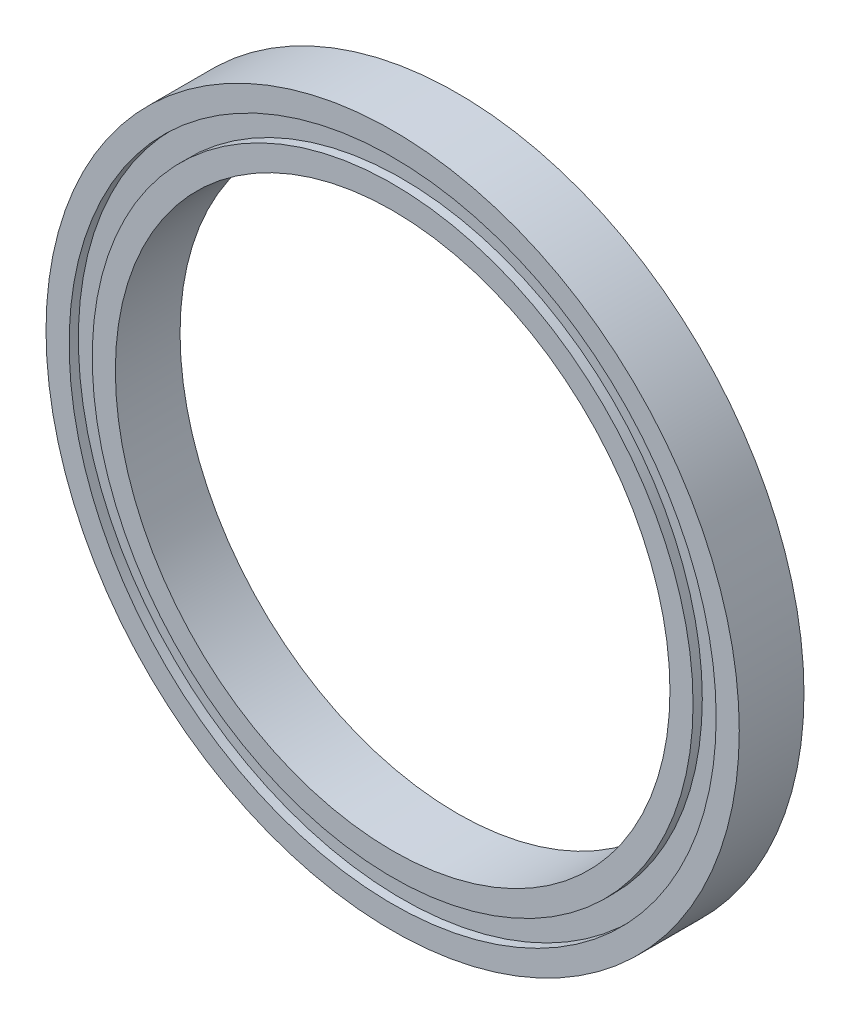
ISO-10303-21;
HEADER;
FILE_DESCRIPTION(('STEP AP214'),'2;1');
FILE_NAME('part.step','',(''),(''),'','','');
FILE_SCHEMA(('AUTOMOTIVE_DESIGN { 1 0 10303 214 1 1 1 1 }'));
ENDSEC;
DATA;
#1=APPLICATION_CONTEXT('core data for automotive mechanical design processes');
#2=APPLICATION_PROTOCOL_DEFINITION('international standard','automotive_design',2000,#1);
#3=PRODUCT_CONTEXT('',#1,'mechanical');
#4=PRODUCT('Part','Part','',(#3));
#5=PRODUCT_RELATED_PRODUCT_CATEGORY('part','',(#4));
#6=PRODUCT_DEFINITION_FORMATION('','',#4);
#7=PRODUCT_DEFINITION_CONTEXT('part definition',#1,'design');
#8=PRODUCT_DEFINITION('design','',#6,#7);
#9=PRODUCT_DEFINITION_SHAPE('','',#8);
#10=(LENGTH_UNIT() NAMED_UNIT(*) SI_UNIT(.MILLI.,.METRE.));
#11=(NAMED_UNIT(*) PLANE_ANGLE_UNIT() SI_UNIT($,.RADIAN.));
#12=(NAMED_UNIT(*) SI_UNIT($,.STERADIAN.) SOLID_ANGLE_UNIT());
#13=UNCERTAINTY_MEASURE_WITH_UNIT(LENGTH_MEASURE(1.E-05),#10,'distance_accuracy_value','');
#14=(GEOMETRIC_REPRESENTATION_CONTEXT(3) GLOBAL_UNCERTAINTY_ASSIGNED_CONTEXT((#13)) GLOBAL_UNIT_ASSIGNED_CONTEXT((#10,
#11,#12)) REPRESENTATION_CONTEXT('',''));
#15=CARTESIAN_POINT('',(0.,0.,0.));
#16=DIRECTION('',(0.,0.,1.));
#17=DIRECTION('',(1.,0.,0.));
#18=AXIS2_PLACEMENT_3D('',#15,#16,#17);
#19=CARTESIAN_POINT('',(0.,0.,0.));
#20=DIRECTION('',(0.,0.,1.));
#21=DIRECTION('',(1.,0.,0.));
#22=AXIS2_PLACEMENT_3D('',#19,#20,#21);
#23=PLANE('',#22);
#24=CARTESIAN_POINT('',(0.,0.,0.));
#25=DIRECTION('',(0.,0.,1.));
#26=DIRECTION('',(1.,0.,0.));
#27=AXIS2_PLACEMENT_3D('',#24,#25,#26);
#28=CIRCLE('',#27,30.);
#29=CARTESIAN_POINT('',(30.,0.,0.));
#30=VERTEX_POINT('',#29);
#31=EDGE_CURVE('E52',#30,#30,#28,.T.);
#32=ORIENTED_EDGE('',*,*,#31,.T.);
#33=EDGE_LOOP('',(#32));
#34=FACE_BOUND('',#33,.T.);
#35=CARTESIAN_POINT('',(0.,0.,0.));
#36=DIRECTION('',(0.,0.,-1.));
#37=DIRECTION('',(-1.,0.,0.));
#38=AXIS2_PLACEMENT_3D('',#35,#36,#37);
#39=CIRCLE('',#38,32.5);
#40=CARTESIAN_POINT('',(-32.5,0.,0.));
#41=VERTEX_POINT('',#40);
#42=EDGE_CURVE('E76',#41,#41,#39,.T.);
#43=ORIENTED_EDGE('',*,*,#42,.T.);
#44=EDGE_LOOP('',(#43));
#45=FACE_BOUND('',#44,.T.);
#46=ADVANCED_FACE('F39',(#34,#45),#23,.F.);
#47=CARTESIAN_POINT('',(0.,0.,7.));
#48=DIRECTION('',(0.,0.,1.));
#49=DIRECTION('',(1.,0.,0.));
#50=AXIS2_PLACEMENT_3D('',#47,#48,#49);
#51=PLANE('',#50);
#52=CARTESIAN_POINT('',(0.,0.,7.));
#53=DIRECTION('',(0.,0.,1.));
#54=DIRECTION('',(1.,0.,0.));
#55=AXIS2_PLACEMENT_3D('',#52,#53,#54);
#56=CIRCLE('',#55,30.);
#57=CARTESIAN_POINT('',(30.,0.,7.));
#58=VERTEX_POINT('',#57);
#59=EDGE_CURVE('E50',#58,#58,#56,.T.);
#60=ORIENTED_EDGE('',*,*,#59,.F.);
#61=EDGE_LOOP('',(#60));
#62=FACE_BOUND('',#61,.T.);
#63=CARTESIAN_POINT('',(0.,0.,7.));
#64=DIRECTION('',(0.,0.,1.));
#65=DIRECTION('',(1.,0.,0.));
#66=AXIS2_PLACEMENT_3D('',#63,#64,#65);
#67=CIRCLE('',#66,32.5);
#68=CARTESIAN_POINT('',(32.5,0.,7.));
#69=VERTEX_POINT('',#68);
#70=EDGE_CURVE('E64',#69,#69,#67,.T.);
#71=ORIENTED_EDGE('',*,*,#70,.T.);
#72=EDGE_LOOP('',(#71));
#73=FACE_BOUND('',#72,.T.);
#74=ADVANCED_FACE('F114',(#62,#73),#51,.T.);
#75=CARTESIAN_POINT('',(0.,0.,7.));
#76=DIRECTION('',(0.,0.,1.));
#77=DIRECTION('',(1.,0.,0.));
#78=AXIS2_PLACEMENT_3D('',#75,#76,#77);
#79=CIRCLE('',#78,35.);
#80=CARTESIAN_POINT('',(35.,0.,7.));
#81=VERTEX_POINT('',#80);
#82=EDGE_CURVE('E58',#81,#81,#79,.T.);
#83=ORIENTED_EDGE('',*,*,#82,.F.);
#84=EDGE_LOOP('',(#83));
#85=FACE_BOUND('',#84,.T.);
#86=CARTESIAN_POINT('',(0.,0.,7.));
#87=DIRECTION('',(0.,0.,1.));
#88=DIRECTION('',(1.,0.,0.));
#89=AXIS2_PLACEMENT_3D('',#86,#87,#88);
#90=CIRCLE('',#89,37.5);
#91=CARTESIAN_POINT('',(37.5,0.,7.));
#92=VERTEX_POINT('',#91);
#93=EDGE_CURVE('E10',#92,#92,#90,.T.);
#94=ORIENTED_EDGE('',*,*,#93,.T.);
#95=EDGE_LOOP('',(#94));
#96=FACE_BOUND('',#95,.T.);
#97=ADVANCED_FACE('F101',(#85,#96),#51,.T.);
#98=CARTESIAN_POINT('',(0.,0.,0.));
#99=DIRECTION('',(0.,0.,-1.));
#100=DIRECTION('',(-1.,0.,0.));
#101=AXIS2_PLACEMENT_3D('',#98,#99,#100);
#102=CIRCLE('',#101,35.);
#103=CARTESIAN_POINT('',(-35.,0.,0.));
#104=VERTEX_POINT('',#103);
#105=EDGE_CURVE('E70',#104,#104,#102,.T.);
#106=ORIENTED_EDGE('',*,*,#105,.F.);
#107=EDGE_LOOP('',(#106));
#108=FACE_BOUND('',#107,.T.);
#109=CARTESIAN_POINT('',(0.,0.,0.));
#110=DIRECTION('',(0.,0.,1.));
#111=DIRECTION('',(1.,0.,0.));
#112=AXIS2_PLACEMENT_3D('',#109,#110,#111);
#113=CIRCLE('',#112,37.5);
#114=CARTESIAN_POINT('',(37.5,0.,0.));
#115=VERTEX_POINT('',#114);
#116=EDGE_CURVE('E43',#115,#115,#113,.T.);
#117=ORIENTED_EDGE('',*,*,#116,.F.);
#118=EDGE_LOOP('',(#117));
#119=FACE_BOUND('',#118,.T.);
#120=ADVANCED_FACE('F98',(#108,#119),#23,.F.);
#121=CARTESIAN_POINT('',(0.,0.,7.));
#122=DIRECTION('',(0.,0.,-1.));
#123=DIRECTION('',(-1.,0.,0.));
#124=AXIS2_PLACEMENT_3D('',#121,#122,#123);
#125=CYLINDRICAL_SURFACE('',#124,37.5);
#126=ORIENTED_EDGE('',*,*,#93,.F.);
#127=EDGE_LOOP('',(#126));
#128=FACE_BOUND('',#127,.T.);
#129=ORIENTED_EDGE('',*,*,#116,.T.);
#130=EDGE_LOOP('',(#129));
#131=FACE_BOUND('',#130,.T.);
#132=ADVANCED_FACE('F41',(#128,#131),#125,.T.);
#133=CARTESIAN_POINT('',(0.,0.,7.));
#134=DIRECTION('',(0.,0.,-1.));
#135=DIRECTION('',(-1.,0.,0.));
#136=AXIS2_PLACEMENT_3D('',#133,#134,#135);
#137=CYLINDRICAL_SURFACE('',#136,30.);
#138=ORIENTED_EDGE('',*,*,#59,.T.);
#139=EDGE_LOOP('',(#138));
#140=FACE_BOUND('',#139,.T.);
#141=ORIENTED_EDGE('',*,*,#31,.F.);
#142=EDGE_LOOP('',(#141));
#143=FACE_BOUND('',#142,.T.);
#144=ADVANCED_FACE('F105',(#140,#143),#137,.F.);
#145=CARTESIAN_POINT('',(0.,0.,6.));
#146=DIRECTION('',(0.,0.,1.));
#147=DIRECTION('',(1.,0.,0.));
#148=AXIS2_PLACEMENT_3D('',#145,#146,#147);
#149=CYLINDRICAL_SURFACE('',#148,35.);
#150=CARTESIAN_POINT('',(0.,0.,6.));
#151=DIRECTION('',(0.,0.,1.));
#152=DIRECTION('',(1.,0.,0.));
#153=AXIS2_PLACEMENT_3D('',#150,#151,#152);
#154=CIRCLE('',#153,35.);
#155=CARTESIAN_POINT('',(35.,0.,6.));
#156=VERTEX_POINT('',#155);
#157=EDGE_CURVE('E55',#156,#156,#154,.T.);
#158=ORIENTED_EDGE('',*,*,#157,.F.);
#159=EDGE_LOOP('',(#158));
#160=FACE_BOUND('',#159,.T.);
#161=ORIENTED_EDGE('',*,*,#82,.T.);
#162=EDGE_LOOP('',(#161));
#163=FACE_BOUND('',#162,.T.);
#164=ADVANCED_FACE('F110',(#160,#163),#149,.F.);
#165=CARTESIAN_POINT('',(0.,0.,6.));
#166=DIRECTION('',(0.,0.,1.));
#167=DIRECTION('',(1.,0.,0.));
#168=AXIS2_PLACEMENT_3D('',#165,#166,#167);
#169=PLANE('',#168);
#170=CARTESIAN_POINT('',(0.,0.,6.));
#171=DIRECTION('',(0.,0.,1.));
#172=DIRECTION('',(1.,0.,0.));
#173=AXIS2_PLACEMENT_3D('',#170,#171,#172);
#174=CIRCLE('',#173,32.5);
#175=CARTESIAN_POINT('',(32.5,0.,6.));
#176=VERTEX_POINT('',#175);
#177=EDGE_CURVE('E61',#176,#176,#174,.T.);
#178=ORIENTED_EDGE('',*,*,#177,.F.);
#179=EDGE_LOOP('',(#178));
#180=FACE_BOUND('',#179,.T.);
#181=ORIENTED_EDGE('',*,*,#157,.T.);
#182=EDGE_LOOP('',(#181));
#183=FACE_BOUND('',#182,.T.);
#184=ADVANCED_FACE('F128',(#180,#183),#169,.T.);
#185=CARTESIAN_POINT('',(0.,0.,6.));
#186=DIRECTION('',(0.,0.,1.));
#187=DIRECTION('',(1.,0.,0.));
#188=AXIS2_PLACEMENT_3D('',#185,#186,#187);
#189=CYLINDRICAL_SURFACE('',#188,32.5);
#190=ORIENTED_EDGE('',*,*,#177,.T.);
#191=EDGE_LOOP('',(#190));
#192=FACE_BOUND('',#191,.T.);
#193=ORIENTED_EDGE('',*,*,#70,.F.);
#194=EDGE_LOOP('',(#193));
#195=FACE_BOUND('',#194,.T.);
#196=ADVANCED_FACE('F94',(#192,#195),#189,.T.);
#197=CARTESIAN_POINT('',(0.,0.,1.));
#198=DIRECTION('',(0.,0.,-1.));
#199=DIRECTION('',(-1.,0.,0.));
#200=AXIS2_PLACEMENT_3D('',#197,#198,#199);
#201=CYLINDRICAL_SURFACE('',#200,35.);
#202=CARTESIAN_POINT('',(0.,0.,1.));
#203=DIRECTION('',(0.,0.,-1.));
#204=DIRECTION('',(-1.,0.,0.));
#205=AXIS2_PLACEMENT_3D('',#202,#203,#204);
#206=CIRCLE('',#205,35.);
#207=CARTESIAN_POINT('',(-35.,0.,1.));
#208=VERTEX_POINT('',#207);
#209=EDGE_CURVE('E67',#208,#208,#206,.T.);
#210=ORIENTED_EDGE('',*,*,#209,.F.);
#211=EDGE_LOOP('',(#210));
#212=FACE_BOUND('',#211,.T.);
#213=ORIENTED_EDGE('',*,*,#105,.T.);
#214=EDGE_LOOP('',(#213));
#215=FACE_BOUND('',#214,.T.);
#216=ADVANCED_FACE('F88',(#212,#215),#201,.F.);
#217=CARTESIAN_POINT('',(0.,0.,1.));
#218=DIRECTION('',(0.,0.,-1.));
#219=DIRECTION('',(-1.,0.,0.));
#220=AXIS2_PLACEMENT_3D('',#217,#218,#219);
#221=PLANE('',#220);
#222=CARTESIAN_POINT('',(0.,0.,1.));
#223=DIRECTION('',(0.,0.,-1.));
#224=DIRECTION('',(-1.,0.,0.));
#225=AXIS2_PLACEMENT_3D('',#222,#223,#224);
#226=CIRCLE('',#225,32.5);
#227=CARTESIAN_POINT('',(-32.5,0.,1.));
#228=VERTEX_POINT('',#227);
#229=EDGE_CURVE('E73',#228,#228,#226,.T.);
#230=ORIENTED_EDGE('',*,*,#229,.F.);
#231=EDGE_LOOP('',(#230));
#232=FACE_BOUND('',#231,.T.);
#233=ORIENTED_EDGE('',*,*,#209,.T.);
#234=EDGE_LOOP('',(#233));
#235=FACE_BOUND('',#234,.T.);
#236=ADVANCED_FACE('F85',(#232,#235),#221,.T.);
#237=CARTESIAN_POINT('',(0.,0.,1.));
#238=DIRECTION('',(0.,0.,-1.));
#239=DIRECTION('',(-1.,0.,0.));
#240=AXIS2_PLACEMENT_3D('',#237,#238,#239);
#241=CYLINDRICAL_SURFACE('',#240,32.5);
#242=ORIENTED_EDGE('',*,*,#229,.T.);
#243=EDGE_LOOP('',(#242));
#244=FACE_BOUND('',#243,.T.);
#245=ORIENTED_EDGE('',*,*,#42,.F.);
#246=EDGE_LOOP('',(#245));
#247=FACE_BOUND('',#246,.T.);
#248=ADVANCED_FACE('F82',(#244,#247),#241,.T.);
#249=CLOSED_SHELL('',(#46,#74,#97,#120,#132,#144,#164,#184,#196,#216,#236,#248));
#250=MANIFOLD_SOLID_BREP('B2',#249);
#251=ADVANCED_BREP_SHAPE_REPRESENTATION('',(#18,#250),#14);
#252=SHAPE_DEFINITION_REPRESENTATION(#9,#251);
ENDSEC;
END-ISO-10303-21;
